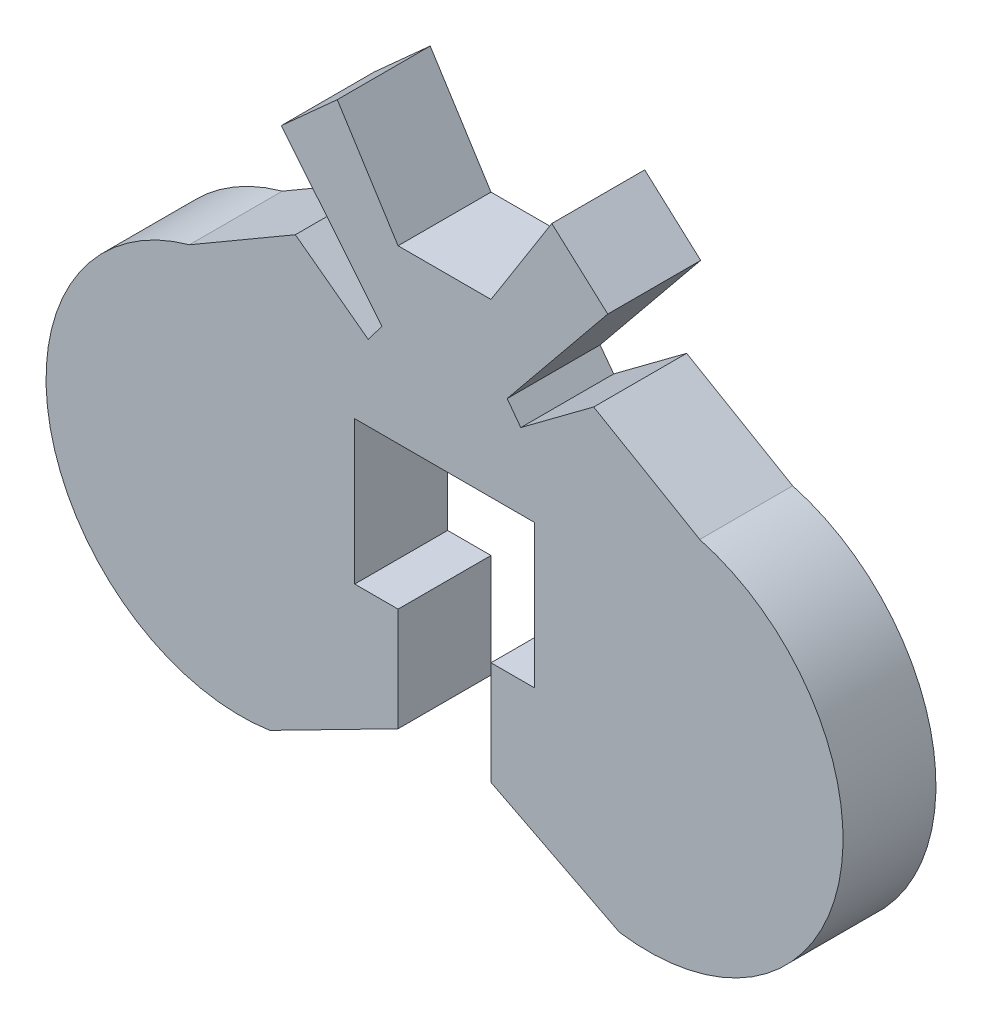
ISO-10303-21;
HEADER;
FILE_DESCRIPTION(('STEP AP214'),'2;1');
FILE_NAME('part.step','',(''),(''),'','','');
FILE_SCHEMA(('AUTOMOTIVE_DESIGN { 1 0 10303 214 1 1 1 1 }'));
ENDSEC;
DATA;
#1=APPLICATION_CONTEXT('core data for automotive mechanical design processes');
#2=APPLICATION_PROTOCOL_DEFINITION('international standard','automotive_design',2000,#1);
#3=PRODUCT_CONTEXT('',#1,'mechanical');
#4=PRODUCT('Part','Part','',(#3));
#5=PRODUCT_RELATED_PRODUCT_CATEGORY('part','',(#4));
#6=PRODUCT_DEFINITION_FORMATION('','',#4);
#7=PRODUCT_DEFINITION_CONTEXT('part definition',#1,'design');
#8=PRODUCT_DEFINITION('design','',#6,#7);
#9=PRODUCT_DEFINITION_SHAPE('','',#8);
#10=(LENGTH_UNIT() NAMED_UNIT(*) SI_UNIT(.MILLI.,.METRE.));
#11=(NAMED_UNIT(*) PLANE_ANGLE_UNIT() SI_UNIT($,.RADIAN.));
#12=(NAMED_UNIT(*) SI_UNIT($,.STERADIAN.) SOLID_ANGLE_UNIT());
#13=UNCERTAINTY_MEASURE_WITH_UNIT(LENGTH_MEASURE(1.E-05),#10,'distance_accuracy_value','');
#14=(GEOMETRIC_REPRESENTATION_CONTEXT(3) GLOBAL_UNCERTAINTY_ASSIGNED_CONTEXT((#13)) GLOBAL_UNIT_ASSIGNED_CONTEXT((#10,
#11,#12)) REPRESENTATION_CONTEXT('',''));
#15=CARTESIAN_POINT('',(0.,0.,0.));
#16=DIRECTION('',(0.,0.,1.));
#17=DIRECTION('',(1.,0.,0.));
#18=AXIS2_PLACEMENT_3D('',#15,#16,#17);
#19=CARTESIAN_POINT('',(-72.3161826663277,193.108811616121,3.));
#20=DIRECTION('',(0.503101526524488,-0.864227316166719,0.));
#21=DIRECTION('',(0.864227316166719,0.503101526524488,0.));
#22=AXIS2_PLACEMENT_3D('',#19,#20,#21);
#23=PLANE('',#22);
#24=DIRECTION('',(-0.864227316166719,-0.503101526524488,0.));
#25=VECTOR('',#24,1.);
#26=CARTESIAN_POINT('',(-72.3161826663277,193.108811616121,0.));
#27=LINE('',#26,#25);
#28=CARTESIAN_POINT('',(-70.6043010627683,194.10536684166,0.));
#29=VERTEX_POINT('',#28);
#30=CARTESIAN_POINT('',(-74.028064269887,192.112256390581,0.));
#31=VERTEX_POINT('',#30);
#32=EDGE_CURVE('E255',#29,#31,#27,.T.);
#33=ORIENTED_EDGE('',*,*,#32,.T.);
#34=DIRECTION('',(0.,0.,-1.));
#35=VECTOR('',#34,1.);
#36=CARTESIAN_POINT('',(-74.028064269887,192.112256390581,3.));
#37=LINE('',#36,#35);
#38=CARTESIAN_POINT('',(-74.028064269887,192.112256390581,3.));
#39=VERTEX_POINT('',#38);
#40=EDGE_CURVE('E371',#39,#31,#37,.T.);
#41=ORIENTED_EDGE('',*,*,#40,.F.);
#42=DIRECTION('',(-0.864227316166719,-0.503101526524488,0.));
#43=VECTOR('',#42,1.);
#44=CARTESIAN_POINT('',(-72.3161826663277,193.108811616121,3.));
#45=LINE('',#44,#43);
#46=CARTESIAN_POINT('',(-70.6043010627683,194.10536684166,3.));
#47=VERTEX_POINT('',#46);
#48=EDGE_CURVE('E323',#47,#39,#45,.T.);
#49=ORIENTED_EDGE('',*,*,#48,.F.);
#50=DIRECTION('',(0.,0.,-1.));
#51=VECTOR('',#50,1.);
#52=CARTESIAN_POINT('',(-70.6043010627683,194.10536684166,3.));
#53=LINE('',#52,#51);
#54=EDGE_CURVE('E251',#47,#29,#53,.T.);
#55=ORIENTED_EDGE('',*,*,#54,.T.);
#56=EDGE_LOOP('',(#33,#41,#49,#55));
#57=FACE_BOUND('',#56,.T.);
#58=ADVANCED_FACE('F38',(#57),#23,.F.);
#59=CARTESIAN_POINT('',(-72.3681894073831,186.048695256863,3.));
#60=DIRECTION('',(0.,0.,-1.));
#61=DIRECTION('',(-1.,0.,0.));
#62=AXIS2_PLACEMENT_3D('',#59,#60,#61);
#63=CYLINDRICAL_SURFACE('',#62,6.28664920140311);
#64=CARTESIAN_POINT('',(-72.3681894073831,186.048695256863,0.));
#65=DIRECTION('',(0.,0.,1.));
#66=DIRECTION('',(1.,0.,0.));
#67=AXIS2_PLACEMENT_3D('',#64,#65,#66);
#68=CIRCLE('',#67,6.28664920140311);
#69=CARTESIAN_POINT('',(-71.4312982419053,179.832249879837,0.));
#70=VERTEX_POINT('',#69);
#71=EDGE_CURVE('E259',#31,#70,#68,.T.);
#72=ORIENTED_EDGE('',*,*,#71,.T.);
#73=DIRECTION('',(0.,0.,-1.));
#74=VECTOR('',#73,1.);
#75=CARTESIAN_POINT('',(-71.4312982419053,179.832249879837,3.));
#76=LINE('',#75,#74);
#77=CARTESIAN_POINT('',(-71.4312982419053,179.832249879837,3.));
#78=VERTEX_POINT('',#77);
#79=EDGE_CURVE('E368',#78,#70,#76,.T.);
#80=ORIENTED_EDGE('',*,*,#79,.F.);
#81=CARTESIAN_POINT('',(-72.3681894073831,186.048695256863,3.));
#82=DIRECTION('',(0.,0.,1.));
#83=DIRECTION('',(1.,0.,0.));
#84=AXIS2_PLACEMENT_3D('',#81,#82,#83);
#85=CIRCLE('',#84,6.28664920140311);
#86=EDGE_CURVE('E159',#39,#78,#85,.T.);
#87=ORIENTED_EDGE('',*,*,#86,.F.);
#88=ORIENTED_EDGE('',*,*,#40,.T.);
#89=EDGE_LOOP('',(#72,#80,#87,#88));
#90=FACE_BOUND('',#89,.T.);
#91=ADVANCED_FACE('F580',(#90),#63,.T.);
#92=CARTESIAN_POINT('',(-69.3597896840998,180.890567600727,3.));
#93=DIRECTION('',(0.45495654078727,-0.890513641666921,0.));
#94=DIRECTION('',(0.890513641666921,0.45495654078727,0.));
#95=AXIS2_PLACEMENT_3D('',#92,#93,#94);
#96=PLANE('',#95);
#97=DIRECTION('',(-0.890513641666921,-0.45495654078727,0.));
#98=VECTOR('',#97,1.);
#99=CARTESIAN_POINT('',(-69.3597896840998,180.890567600727,0.));
#100=LINE('',#99,#98);
#101=CARTESIAN_POINT('',(-67.2882811262942,181.948885321617,0.));
#102=VERTEX_POINT('',#101);
#103=EDGE_CURVE('E264',#102,#70,#100,.T.);
#104=ORIENTED_EDGE('',*,*,#103,.F.);
#105=DIRECTION('',(0.,0.,-1.));
#106=VECTOR('',#105,1.);
#107=CARTESIAN_POINT('',(-67.2882811262942,181.948885321617,3.));
#108=LINE('',#107,#106);
#109=CARTESIAN_POINT('',(-67.2882811262942,181.948885321617,3.));
#110=VERTEX_POINT('',#109);
#111=EDGE_CURVE('E365',#110,#102,#108,.T.);
#112=ORIENTED_EDGE('',*,*,#111,.F.);
#113=DIRECTION('',(-0.890513641666921,-0.45495654078727,0.));
#114=VECTOR('',#113,1.);
#115=CARTESIAN_POINT('',(-69.3597896840998,180.890567600727,3.));
#116=LINE('',#115,#114);
#117=EDGE_CURVE('E430',#110,#78,#116,.T.);
#118=ORIENTED_EDGE('',*,*,#117,.T.);
#119=ORIENTED_EDGE('',*,*,#79,.T.);
#120=EDGE_LOOP('',(#104,#112,#118,#119));
#121=FACE_BOUND('',#120,.T.);
#122=ADVANCED_FACE('F602',(#121),#96,.T.);
#123=CARTESIAN_POINT('',(-67.2882811262942,183.250493427698,3.));
#124=DIRECTION('',(-1.,0.,0.));
#125=DIRECTION('',(0.,0.,1.));
#126=AXIS2_PLACEMENT_3D('',#123,#124,#125);
#127=PLANE('',#126);
#128=DIRECTION('',(0.,1.,0.));
#129=VECTOR('',#128,1.);
#130=CARTESIAN_POINT('',(-67.2882811262942,183.250493427698,0.));
#131=LINE('',#130,#129);
#132=CARTESIAN_POINT('',(-67.2882811262942,185.295085507677,0.));
#133=VERTEX_POINT('',#132);
#134=EDGE_CURVE('E268',#102,#133,#131,.T.);
#135=ORIENTED_EDGE('',*,*,#134,.T.);
#136=DIRECTION('',(0.,0.,1.));
#137=VECTOR('',#136,1.);
#138=CARTESIAN_POINT('',(-67.2882811262942,185.295085507677,3.));
#139=LINE('',#138,#137);
#140=CARTESIAN_POINT('',(-67.2882811262942,185.295085507677,3.));
#141=VERTEX_POINT('',#140);
#142=EDGE_CURVE('E260',#133,#141,#139,.T.);
#143=ORIENTED_EDGE('',*,*,#142,.T.);
#144=DIRECTION('',(0.,1.,0.));
#145=VECTOR('',#144,1.);
#146=CARTESIAN_POINT('',(-67.2882811262942,183.250493427698,3.));
#147=LINE('',#146,#145);
#148=EDGE_CURVE('E434',#110,#141,#147,.T.);
#149=ORIENTED_EDGE('',*,*,#148,.F.);
#150=ORIENTED_EDGE('',*,*,#111,.T.);
#151=EDGE_LOOP('',(#135,#143,#149,#150));
#152=FACE_BOUND('',#151,.T.);
#153=ADVANCED_FACE('F507',(#152),#127,.F.);
#154=CARTESIAN_POINT('',(-64.2882811262942,186.557534406933,3.));
#155=DIRECTION('',(1.,0.,0.));
#156=DIRECTION('',(0.,0.,-1.));
#157=AXIS2_PLACEMENT_3D('',#154,#155,#156);
#158=PLANE('',#157);
#159=DIRECTION('',(0.,-1.,0.));
#160=VECTOR('',#159,1.);
#161=CARTESIAN_POINT('',(-64.2882811262942,186.557534406933,3.));
#162=LINE('',#161,#160);
#163=CARTESIAN_POINT('',(-64.2882811262942,185.295085507677,3.));
#164=VERTEX_POINT('',#163);
#165=CARTESIAN_POINT('',(-64.2882811262942,181.948885321617,3.));
#166=VERTEX_POINT('',#165);
#167=EDGE_CURVE('E438',#164,#166,#162,.T.);
#168=ORIENTED_EDGE('',*,*,#167,.F.);
#169=DIRECTION('',(0.,0.,-1.));
#170=VECTOR('',#169,1.);
#171=CARTESIAN_POINT('',(-64.2882811262942,185.295085507677,3.));
#172=LINE('',#171,#170);
#173=CARTESIAN_POINT('',(-64.2882811262942,185.295085507677,0.));
#174=VERTEX_POINT('',#173);
#175=EDGE_CURVE('E412',#164,#174,#172,.T.);
#176=ORIENTED_EDGE('',*,*,#175,.T.);
#177=DIRECTION('',(0.,-1.,0.));
#178=VECTOR('',#177,1.);
#179=CARTESIAN_POINT('',(-64.2882811262942,186.557534406933,0.));
#180=LINE('',#179,#178);
#181=CARTESIAN_POINT('',(-64.2882811262942,181.948885321617,0.));
#182=VERTEX_POINT('',#181);
#183=EDGE_CURVE('E271',#174,#182,#180,.T.);
#184=ORIENTED_EDGE('',*,*,#183,.T.);
#185=DIRECTION('',(0.,0.,-1.));
#186=VECTOR('',#185,1.);
#187=CARTESIAN_POINT('',(-64.2882811262942,181.948885321617,3.));
#188=LINE('',#187,#186);
#189=EDGE_CURVE('E361',#166,#182,#188,.T.);
#190=ORIENTED_EDGE('',*,*,#189,.F.);
#191=EDGE_LOOP('',(#168,#176,#184,#190));
#192=FACE_BOUND('',#191,.T.);
#193=ADVANCED_FACE('F501',(#192),#158,.F.);
#194=CARTESIAN_POINT('',(-62.2167725684887,180.890567600727,3.));
#195=DIRECTION('',(0.45495654078727,0.890513641666921,0.));
#196=DIRECTION('',(-0.890513641666921,0.45495654078727,0.));
#197=AXIS2_PLACEMENT_3D('',#194,#195,#196);
#198=PLANE('',#197);
#199=DIRECTION('',(0.890513641666921,-0.45495654078727,0.));
#200=VECTOR('',#199,1.);
#201=CARTESIAN_POINT('',(-62.2167725684887,180.890567600727,0.));
#202=LINE('',#201,#200);
#203=CARTESIAN_POINT('',(-60.1452640106832,179.832249879837,0.));
#204=VERTEX_POINT('',#203);
#205=EDGE_CURVE('E274',#182,#204,#202,.T.);
#206=ORIENTED_EDGE('',*,*,#205,.T.);
#207=DIRECTION('',(0.,0.,-1.));
#208=VECTOR('',#207,1.);
#209=CARTESIAN_POINT('',(-60.1452640106832,179.832249879837,3.));
#210=LINE('',#209,#208);
#211=CARTESIAN_POINT('',(-60.1452640106832,179.832249879837,3.));
#212=VERTEX_POINT('',#211);
#213=EDGE_CURVE('E358',#212,#204,#210,.T.);
#214=ORIENTED_EDGE('',*,*,#213,.F.);
#215=DIRECTION('',(0.890513641666921,-0.45495654078727,0.));
#216=VECTOR('',#215,1.);
#217=CARTESIAN_POINT('',(-62.2167725684887,180.890567600727,3.));
#218=LINE('',#217,#216);
#219=EDGE_CURVE('E441',#166,#212,#218,.T.);
#220=ORIENTED_EDGE('',*,*,#219,.F.);
#221=ORIENTED_EDGE('',*,*,#189,.T.);
#222=EDGE_LOOP('',(#206,#214,#220,#221));
#223=FACE_BOUND('',#222,.T.);
#224=ADVANCED_FACE('F506',(#223),#198,.F.);
#225=CARTESIAN_POINT('',(-59.2083728452044,186.048695256863,3.));
#226=DIRECTION('',(0.,0.,-1.));
#227=DIRECTION('',(-1.,0.,0.));
#228=AXIS2_PLACEMENT_3D('',#225,#226,#227);
#229=CYLINDRICAL_SURFACE('',#228,6.2866492014031);
#230=CARTESIAN_POINT('',(-59.2083728452044,186.048695256863,0.));
#231=DIRECTION('',(0.,0.,-1.));
#232=DIRECTION('',(1.,0.,0.));
#233=AXIS2_PLACEMENT_3D('',#230,#231,#232);
#234=CIRCLE('',#233,6.2866492014031);
#235=CARTESIAN_POINT('',(-57.5484979827017,192.112256390581,0.));
#236=VERTEX_POINT('',#235);
#237=EDGE_CURVE('E278',#236,#204,#234,.T.);
#238=ORIENTED_EDGE('',*,*,#237,.F.);
#239=DIRECTION('',(0.,0.,-1.));
#240=VECTOR('',#239,1.);
#241=CARTESIAN_POINT('',(-57.5484979827017,192.112256390581,3.));
#242=LINE('',#241,#240);
#243=CARTESIAN_POINT('',(-57.5484979827017,192.112256390581,3.));
#244=VERTEX_POINT('',#243);
#245=EDGE_CURVE('E355',#244,#236,#242,.T.);
#246=ORIENTED_EDGE('',*,*,#245,.F.);
#247=CARTESIAN_POINT('',(-59.2083728452044,186.048695256863,3.));
#248=DIRECTION('',(0.,0.,-1.));
#249=DIRECTION('',(1.,0.,0.));
#250=AXIS2_PLACEMENT_3D('',#247,#248,#249);
#251=CIRCLE('',#250,6.2866492014031);
#252=EDGE_CURVE('E444',#244,#212,#251,.T.);
#253=ORIENTED_EDGE('',*,*,#252,.T.);
#254=ORIENTED_EDGE('',*,*,#213,.T.);
#255=EDGE_LOOP('',(#238,#246,#253,#254));
#256=FACE_BOUND('',#255,.T.);
#257=ADVANCED_FACE('F530',(#256),#229,.T.);
#258=CARTESIAN_POINT('',(-59.2603795862609,193.108811616121,3.));
#259=DIRECTION('',(0.503101526524491,0.864227316166717,0.));
#260=DIRECTION('',(-0.864227316166717,0.503101526524491,0.));
#261=AXIS2_PLACEMENT_3D('',#258,#259,#260);
#262=PLANE('',#261);
#263=DIRECTION('',(0.864227316166717,-0.503101526524491,0.));
#264=VECTOR('',#263,1.);
#265=CARTESIAN_POINT('',(-59.2603795862609,193.108811616121,0.));
#266=LINE('',#265,#264);
#267=CARTESIAN_POINT('',(-60.9722611898201,194.10536684166,0.));
#268=VERTEX_POINT('',#267);
#269=EDGE_CURVE('E282',#268,#236,#266,.T.);
#270=ORIENTED_EDGE('',*,*,#269,.F.);
#271=DIRECTION('',(0.,0.,-1.));
#272=VECTOR('',#271,1.);
#273=CARTESIAN_POINT('',(-60.9722611898201,194.10536684166,3.));
#274=LINE('',#273,#272);
#275=CARTESIAN_POINT('',(-60.9722611898201,194.10536684166,3.));
#276=VERTEX_POINT('',#275);
#277=EDGE_CURVE('E352',#276,#268,#274,.T.);
#278=ORIENTED_EDGE('',*,*,#277,.F.);
#279=DIRECTION('',(0.864227316166717,-0.503101526524491,0.));
#280=VECTOR('',#279,1.);
#281=CARTESIAN_POINT('',(-59.2603795862609,193.108811616121,3.));
#282=LINE('',#281,#280);
#283=EDGE_CURVE('E448',#276,#244,#282,.T.);
#284=ORIENTED_EDGE('',*,*,#283,.T.);
#285=ORIENTED_EDGE('',*,*,#245,.T.);
#286=EDGE_LOOP('',(#270,#278,#284,#285));
#287=FACE_BOUND('',#286,.T.);
#288=ADVANCED_FACE('F520',(#287),#262,.T.);
#289=CARTESIAN_POINT('',(-62.1493132803896,193.22889515274,3.));
#290=DIRECTION('',(-0.597241395654516,0.802061540853722,0.));
#291=DIRECTION('',(-0.802061540853722,-0.597241395654516,0.));
#292=AXIS2_PLACEMENT_3D('',#289,#290,#291);
#293=PLANE('',#292);
#294=DIRECTION('',(0.802061540853722,0.597241395654516,0.));
#295=VECTOR('',#294,1.);
#296=CARTESIAN_POINT('',(-62.1493132803896,193.22889515274,0.));
#297=LINE('',#296,#295);
#298=CARTESIAN_POINT('',(-63.3263653709592,192.35242346382,0.));
#299=VERTEX_POINT('',#298);
#300=EDGE_CURVE('E286',#299,#268,#297,.T.);
#301=ORIENTED_EDGE('',*,*,#300,.F.);
#302=DIRECTION('',(0.,0.,-1.));
#303=VECTOR('',#302,1.);
#304=CARTESIAN_POINT('',(-63.3263653709592,192.35242346382,3.));
#305=LINE('',#304,#303);
#306=CARTESIAN_POINT('',(-63.3263653709592,192.35242346382,3.));
#307=VERTEX_POINT('',#306);
#308=EDGE_CURVE('E349',#307,#299,#305,.T.);
#309=ORIENTED_EDGE('',*,*,#308,.F.);
#310=DIRECTION('',(0.802061540853722,0.597241395654516,0.));
#311=VECTOR('',#310,1.);
#312=CARTESIAN_POINT('',(-62.1493132803896,193.22889515274,3.));
#313=LINE('',#312,#311);
#314=EDGE_CURVE('E452',#307,#276,#313,.T.);
#315=ORIENTED_EDGE('',*,*,#314,.T.);
#316=ORIENTED_EDGE('',*,*,#277,.T.);
#317=EDGE_LOOP('',(#301,#309,#315,#316));
#318=FACE_BOUND('',#317,.T.);
#319=ADVANCED_FACE('F514',(#318),#293,.T.);
#320=CARTESIAN_POINT('',(-63.5463576841203,192.647860744212,3.));
#321=DIRECTION('',(-0.802061540853723,-0.597241395654515,0.));
#322=DIRECTION('',(0.597241395654515,-0.802061540853723,0.));
#323=AXIS2_PLACEMENT_3D('',#320,#321,#322);
#324=PLANE('',#323);
#325=DIRECTION('',(-0.597241395654515,0.802061540853723,0.));
#326=VECTOR('',#325,1.);
#327=CARTESIAN_POINT('',(-63.5463576841203,192.647860744212,0.));
#328=LINE('',#327,#326);
#329=CARTESIAN_POINT('',(-63.7663499972815,192.943298024605,0.));
#330=VERTEX_POINT('',#329);
#331=EDGE_CURVE('E290',#299,#330,#328,.T.);
#332=ORIENTED_EDGE('',*,*,#331,.T.);
#333=DIRECTION('',(0.,0.,-1.));
#334=VECTOR('',#333,1.);
#335=CARTESIAN_POINT('',(-63.7663499972815,192.943298024605,3.));
#336=LINE('',#335,#334);
#337=CARTESIAN_POINT('',(-63.7663499972815,192.943298024605,3.));
#338=VERTEX_POINT('',#337);
#339=EDGE_CURVE('E345',#338,#330,#336,.T.);
#340=ORIENTED_EDGE('',*,*,#339,.F.);
#341=DIRECTION('',(-0.597241395654515,0.802061540853723,0.));
#342=VECTOR('',#341,1.);
#343=CARTESIAN_POINT('',(-63.5463576841203,192.647860744212,3.));
#344=LINE('',#343,#342);
#345=EDGE_CURVE('E456',#307,#338,#344,.T.);
#346=ORIENTED_EDGE('',*,*,#345,.F.);
#347=ORIENTED_EDGE('',*,*,#308,.T.);
#348=EDGE_LOOP('',(#332,#340,#346,#347));
#349=FACE_BOUND('',#348,.T.);
#350=ADVANCED_FACE('F519',(#349),#324,.F.);
#351=CARTESIAN_POINT('',(-62.1423883232009,194.936670732909,3.));
#352=DIRECTION('',(-0.775286014305936,0.631610319755477,0.));
#353=DIRECTION('',(-0.631610319755478,-0.775286014305936,0.));
#354=AXIS2_PLACEMENT_3D('',#351,#352,#353);
#355=PLANE('',#354);
#356=DIRECTION('',(0.631610319755478,0.775286014305936,0.));
#357=VECTOR('',#356,1.);
#358=CARTESIAN_POINT('',(-62.1423883232009,194.936670732909,0.));
#359=LINE('',#358,#357);
#360=CARTESIAN_POINT('',(-60.5184266491204,196.930043441212,0.));
#361=VERTEX_POINT('',#360);
#362=EDGE_CURVE('E293',#330,#361,#359,.T.);
#363=ORIENTED_EDGE('',*,*,#362,.T.);
#364=DIRECTION('',(0.,0.,-1.));
#365=VECTOR('',#364,1.);
#366=CARTESIAN_POINT('',(-60.5184266491204,196.930043441212,3.));
#367=LINE('',#366,#365);
#368=CARTESIAN_POINT('',(-60.5184266491204,196.930043441212,3.));
#369=VERTEX_POINT('',#368);
#370=EDGE_CURVE('E342',#369,#361,#367,.T.);
#371=ORIENTED_EDGE('',*,*,#370,.F.);
#372=DIRECTION('',(0.631610319755478,0.775286014305936,0.));
#373=VECTOR('',#372,1.);
#374=CARTESIAN_POINT('',(-62.1423883232009,194.936670732909,3.));
#375=LINE('',#374,#373);
#376=EDGE_CURVE('E459',#338,#369,#375,.T.);
#377=ORIENTED_EDGE('',*,*,#376,.F.);
#378=ORIENTED_EDGE('',*,*,#339,.T.);
#379=EDGE_LOOP('',(#363,#371,#377,#378));
#380=FACE_BOUND('',#379,.T.);
#381=ADVANCED_FACE('F539',(#380),#355,.F.);
#382=CARTESIAN_POINT('',(-61.4218751648041,197.74438241128,3.));
#383=DIRECTION('',(0.669525663872529,0.74278892386468,0.));
#384=DIRECTION('',(-0.74278892386468,0.669525663872529,0.));
#385=AXIS2_PLACEMENT_3D('',#382,#383,#384);
#386=PLANE('',#385);
#387=DIRECTION('',(0.74278892386468,-0.669525663872529,0.));
#388=VECTOR('',#387,1.);
#389=CARTESIAN_POINT('',(-61.4218751648041,197.74438241128,0.));
#390=LINE('',#389,#388);
#391=CARTESIAN_POINT('',(-62.3253236804879,198.558721381348,0.));
#392=VERTEX_POINT('',#391);
#393=EDGE_CURVE('E297',#392,#361,#390,.T.);
#394=ORIENTED_EDGE('',*,*,#393,.F.);
#395=DIRECTION('',(0.,0.,-1.));
#396=VECTOR('',#395,1.);
#397=CARTESIAN_POINT('',(-62.3253236804879,198.558721381348,3.));
#398=LINE('',#397,#396);
#399=CARTESIAN_POINT('',(-62.3253236804879,198.558721381348,3.));
#400=VERTEX_POINT('',#399);
#401=EDGE_CURVE('E339',#400,#392,#398,.T.);
#402=ORIENTED_EDGE('',*,*,#401,.F.);
#403=DIRECTION('',(0.74278892386468,-0.669525663872529,0.));
#404=VECTOR('',#403,1.);
#405=CARTESIAN_POINT('',(-61.4218751648041,197.74438241128,3.));
#406=LINE('',#405,#404);
#407=EDGE_CURVE('E462',#400,#369,#406,.T.);
#408=ORIENTED_EDGE('',*,*,#407,.T.);
#409=ORIENTED_EDGE('',*,*,#370,.T.);
#410=EDGE_LOOP('',(#394,#402,#408,#409));
#411=FACE_BOUND('',#410,.T.);
#412=ADVANCED_FACE('F551',(#411),#386,.T.);
#413=CARTESIAN_POINT('',(-62.8258445257236,197.767069618765,3.));
#414=DIRECTION('',(-0.845233198816856,0.534397641852792,0.));
#415=DIRECTION('',(-0.534397641852792,-0.845233198816857,0.));
#416=AXIS2_PLACEMENT_3D('',#413,#414,#415);
#417=PLANE('',#416);
#418=DIRECTION('',(0.534397641852792,0.845233198816856,0.));
#419=VECTOR('',#418,1.);
#420=CARTESIAN_POINT('',(-62.8258445257236,197.767069618765,0.));
#421=LINE('',#420,#419);
#422=CARTESIAN_POINT('',(-64.2882811262942,195.453998098311,0.));
#423=VERTEX_POINT('',#422);
#424=EDGE_CURVE('E301',#423,#392,#421,.T.);
#425=ORIENTED_EDGE('',*,*,#424,.F.);
#426=DIRECTION('',(0.,0.,-1.));
#427=VECTOR('',#426,1.);
#428=CARTESIAN_POINT('',(-64.2882811262942,195.453998098311,3.));
#429=LINE('',#428,#427);
#430=CARTESIAN_POINT('',(-64.2882811262942,195.453998098311,3.));
#431=VERTEX_POINT('',#430);
#432=EDGE_CURVE('E336',#431,#423,#429,.T.);
#433=ORIENTED_EDGE('',*,*,#432,.F.);
#434=DIRECTION('',(0.534397641852792,0.845233198816856,0.));
#435=VECTOR('',#434,1.);
#436=CARTESIAN_POINT('',(-62.8258445257236,197.767069618765,3.));
#437=LINE('',#436,#435);
#438=EDGE_CURVE('E466',#431,#400,#437,.T.);
#439=ORIENTED_EDGE('',*,*,#438,.T.);
#440=ORIENTED_EDGE('',*,*,#401,.T.);
#441=EDGE_LOOP('',(#425,#433,#439,#440));
#442=FACE_BOUND('',#441,.T.);
#443=ADVANCED_FACE('F545',(#442),#417,.T.);
#444=CARTESIAN_POINT('',(-65.0382811262942,195.453998098311,3.));
#445=DIRECTION('',(0.,-1.,0.));
#446=DIRECTION('',(0.,0.,-1.));
#447=AXIS2_PLACEMENT_3D('',#444,#445,#446);
#448=PLANE('',#447);
#449=DIRECTION('',(-1.,0.,0.));
#450=VECTOR('',#449,1.);
#451=CARTESIAN_POINT('',(-65.0382811262942,195.453998098311,0.));
#452=LINE('',#451,#450);
#453=CARTESIAN_POINT('',(-67.2882811262942,195.453998098311,0.));
#454=VERTEX_POINT('',#453);
#455=EDGE_CURVE('E305',#423,#454,#452,.T.);
#456=ORIENTED_EDGE('',*,*,#455,.T.);
#457=DIRECTION('',(0.,0.,-1.));
#458=VECTOR('',#457,1.);
#459=CARTESIAN_POINT('',(-67.2882811262942,195.453998098311,3.));
#460=LINE('',#459,#458);
#461=CARTESIAN_POINT('',(-67.2882811262942,195.453998098311,3.));
#462=VERTEX_POINT('',#461);
#463=EDGE_CURVE('E333',#462,#454,#460,.T.);
#464=ORIENTED_EDGE('',*,*,#463,.F.);
#465=DIRECTION('',(-1.,0.,0.));
#466=VECTOR('',#465,1.);
#467=CARTESIAN_POINT('',(-65.0382811262942,195.453998098311,3.));
#468=LINE('',#467,#466);
#469=EDGE_CURVE('E470',#431,#462,#468,.T.);
#470=ORIENTED_EDGE('',*,*,#469,.F.);
#471=ORIENTED_EDGE('',*,*,#432,.T.);
#472=EDGE_LOOP('',(#456,#464,#470,#471));
#473=FACE_BOUND('',#472,.T.);
#474=ADVANCED_FACE('F550',(#473),#448,.F.);
#475=CARTESIAN_POINT('',(-67.7692390039617,196.214707977246,3.));
#476=DIRECTION('',(0.845233198816857,0.53439764185279,0.));
#477=DIRECTION('',(-0.53439764185279,0.845233198816857,0.));
#478=AXIS2_PLACEMENT_3D('',#475,#476,#477);
#479=PLANE('',#478);
#480=DIRECTION('',(0.53439764185279,-0.845233198816857,0.));
#481=VECTOR('',#480,1.);
#482=CARTESIAN_POINT('',(-67.7692390039617,196.214707977246,0.));
#483=LINE('',#482,#481);
#484=CARTESIAN_POINT('',(-69.2512385721006,198.558721381348,0.));
#485=VERTEX_POINT('',#484);
#486=EDGE_CURVE('E309',#485,#454,#483,.T.);
#487=ORIENTED_EDGE('',*,*,#486,.F.);
#488=DIRECTION('',(0.,0.,-1.));
#489=VECTOR('',#488,1.);
#490=CARTESIAN_POINT('',(-69.2512385721006,198.558721381348,3.));
#491=LINE('',#490,#489);
#492=CARTESIAN_POINT('',(-69.2512385721006,198.558721381348,3.));
#493=VERTEX_POINT('',#492);
#494=EDGE_CURVE('E330',#493,#485,#491,.T.);
#495=ORIENTED_EDGE('',*,*,#494,.F.);
#496=DIRECTION('',(0.53439764185279,-0.845233198816857,0.));
#497=VECTOR('',#496,1.);
#498=CARTESIAN_POINT('',(-67.7692390039617,196.214707977246,3.));
#499=LINE('',#498,#497);
#500=EDGE_CURVE('E473',#493,#462,#499,.T.);
#501=ORIENTED_EDGE('',*,*,#500,.T.);
#502=ORIENTED_EDGE('',*,*,#463,.T.);
#503=EDGE_LOOP('',(#487,#495,#501,#502));
#504=FACE_BOUND('',#503,.T.);
#505=ADVANCED_FACE('F561',(#504),#479,.T.);
#506=CARTESIAN_POINT('',(-70.1546870877843,197.74438241128,3.));
#507=DIRECTION('',(0.669525663872529,-0.74278892386468,0.));
#508=DIRECTION('',(0.74278892386468,0.669525663872529,0.));
#509=AXIS2_PLACEMENT_3D('',#506,#507,#508);
#510=PLANE('',#509);
#511=DIRECTION('',(-0.74278892386468,-0.669525663872529,0.));
#512=VECTOR('',#511,1.);
#513=CARTESIAN_POINT('',(-70.1546870877843,197.74438241128,0.));
#514=LINE('',#513,#512);
#515=CARTESIAN_POINT('',(-71.0581356034681,196.930043441212,0.));
#516=VERTEX_POINT('',#515);
#517=EDGE_CURVE('E313',#485,#516,#514,.T.);
#518=ORIENTED_EDGE('',*,*,#517,.T.);
#519=DIRECTION('',(0.,0.,-1.));
#520=VECTOR('',#519,1.);
#521=CARTESIAN_POINT('',(-71.0581356034681,196.930043441212,3.));
#522=LINE('',#521,#520);
#523=CARTESIAN_POINT('',(-71.0581356034681,196.930043441212,3.));
#524=VERTEX_POINT('',#523);
#525=EDGE_CURVE('E232',#524,#516,#522,.T.);
#526=ORIENTED_EDGE('',*,*,#525,.F.);
#527=DIRECTION('',(-0.74278892386468,-0.669525663872529,0.));
#528=VECTOR('',#527,1.);
#529=CARTESIAN_POINT('',(-70.1546870877843,197.74438241128,3.));
#530=LINE('',#529,#528);
#531=EDGE_CURVE('E240',#493,#524,#530,.T.);
#532=ORIENTED_EDGE('',*,*,#531,.F.);
#533=ORIENTED_EDGE('',*,*,#494,.T.);
#534=EDGE_LOOP('',(#518,#526,#532,#533));
#535=FACE_BOUND('',#534,.T.);
#536=ADVANCED_FACE('F570',(#535),#510,.F.);
#537=CARTESIAN_POINT('',(-69.4341739293875,194.936670732909,3.));
#538=DIRECTION('',(-0.775286014305936,-0.631610319755477,0.));
#539=DIRECTION('',(0.631610319755477,-0.775286014305937,0.));
#540=AXIS2_PLACEMENT_3D('',#537,#538,#539);
#541=PLANE('',#540);
#542=DIRECTION('',(-0.631610319755477,0.775286014305936,0.));
#543=VECTOR('',#542,1.);
#544=CARTESIAN_POINT('',(-69.4341739293875,194.936670732909,0.));
#545=LINE('',#544,#543);
#546=CARTESIAN_POINT('',(-67.810212255307,192.943298024605,0.));
#547=VERTEX_POINT('',#546);
#548=EDGE_CURVE('E226',#547,#516,#545,.T.);
#549=ORIENTED_EDGE('',*,*,#548,.F.);
#550=DIRECTION('',(0.,0.,-1.));
#551=VECTOR('',#550,1.);
#552=CARTESIAN_POINT('',(-67.810212255307,192.943298024605,3.));
#553=LINE('',#552,#551);
#554=CARTESIAN_POINT('',(-67.810212255307,192.943298024605,3.));
#555=VERTEX_POINT('',#554);
#556=EDGE_CURVE('E221',#555,#547,#553,.T.);
#557=ORIENTED_EDGE('',*,*,#556,.F.);
#558=DIRECTION('',(-0.631610319755477,0.775286014305936,0.));
#559=VECTOR('',#558,1.);
#560=CARTESIAN_POINT('',(-69.4341739293875,194.936670732909,3.));
#561=LINE('',#560,#559);
#562=EDGE_CURVE('E224',#555,#524,#561,.T.);
#563=ORIENTED_EDGE('',*,*,#562,.T.);
#564=ORIENTED_EDGE('',*,*,#525,.T.);
#565=EDGE_LOOP('',(#549,#557,#563,#564));
#566=FACE_BOUND('',#565,.T.);
#567=ADVANCED_FACE('F223',(#566),#541,.T.);
#568=CARTESIAN_POINT('',(-68.0302045684681,192.647860744212,3.));
#569=DIRECTION('',(-0.802061540853727,0.597241395654508,0.));
#570=DIRECTION('',(-0.597241395654509,-0.802061540853727,0.));
#571=AXIS2_PLACEMENT_3D('',#568,#569,#570);
#572=PLANE('',#571);
#573=DIRECTION('',(0.597241395654509,0.802061540853727,0.));
#574=VECTOR('',#573,1.);
#575=CARTESIAN_POINT('',(-68.0302045684681,192.647860744212,0.));
#576=LINE('',#575,#574);
#577=CARTESIAN_POINT('',(-68.2501968816292,192.35242346382,0.));
#578=VERTEX_POINT('',#577);
#579=EDGE_CURVE('E319',#578,#547,#576,.T.);
#580=ORIENTED_EDGE('',*,*,#579,.F.);
#581=DIRECTION('',(0.,0.,-1.));
#582=VECTOR('',#581,1.);
#583=CARTESIAN_POINT('',(-68.2501968816292,192.35242346382,3.));
#584=LINE('',#583,#582);
#585=CARTESIAN_POINT('',(-68.2501968816292,192.35242346382,3.));
#586=VERTEX_POINT('',#585);
#587=EDGE_CURVE('E233',#586,#578,#584,.T.);
#588=ORIENTED_EDGE('',*,*,#587,.F.);
#589=DIRECTION('',(0.597241395654509,0.802061540853727,0.));
#590=VECTOR('',#589,1.);
#591=CARTESIAN_POINT('',(-68.0302045684681,192.647860744212,3.));
#592=LINE('',#591,#590);
#593=EDGE_CURVE('E237',#586,#555,#592,.T.);
#594=ORIENTED_EDGE('',*,*,#593,.T.);
#595=ORIENTED_EDGE('',*,*,#556,.T.);
#596=EDGE_LOOP('',(#580,#588,#594,#595));
#597=FACE_BOUND('',#596,.T.);
#598=ADVANCED_FACE('F244',(#597),#572,.T.);
#599=CARTESIAN_POINT('',(-69.4272489721988,193.22889515274,3.));
#600=DIRECTION('',(-0.597241395654517,-0.802061540853721,0.));
#601=DIRECTION('',(0.802061540853721,-0.597241395654517,0.));
#602=AXIS2_PLACEMENT_3D('',#599,#600,#601);
#603=PLANE('',#602);
#604=DIRECTION('',(-0.802061540853721,0.597241395654517,0.));
#605=VECTOR('',#604,1.);
#606=CARTESIAN_POINT('',(-69.4272489721988,193.22889515274,0.));
#607=LINE('',#606,#605);
#608=EDGE_CURVE('E148',#578,#29,#607,.T.);
#609=ORIENTED_EDGE('',*,*,#608,.T.);
#610=ORIENTED_EDGE('',*,*,#54,.F.);
#611=DIRECTION('',(-0.802061540853721,0.597241395654517,0.));
#612=VECTOR('',#611,1.);
#613=CARTESIAN_POINT('',(-69.4272489721988,193.22889515274,3.));
#614=LINE('',#613,#612);
#615=EDGE_CURVE('E66',#586,#47,#614,.T.);
#616=ORIENTED_EDGE('',*,*,#615,.F.);
#617=ORIENTED_EDGE('',*,*,#587,.T.);
#618=EDGE_LOOP('',(#609,#610,#616,#617));
#619=FACE_BOUND('',#618,.T.);
#620=ADVANCED_FACE('F496',(#619),#603,.F.);
#621=CARTESIAN_POINT('',(221.883213984944,-32.3050135869362,3.));
#622=DIRECTION('',(0.,0.,1.));
#623=DIRECTION('',(1.,0.,0.));
#624=AXIS2_PLACEMENT_3D('',#621,#622,#623);
#625=PLANE('',#624);
#626=DIRECTION('',(1.,0.,0.));
#627=VECTOR('',#626,1.);
#628=CARTESIAN_POINT('',(-62.888281126294,185.295085507677,3.));
#629=LINE('',#628,#627);
#630=CARTESIAN_POINT('',(-62.888281126294,185.295085507677,3.));
#631=VERTEX_POINT('',#630);
#632=EDGE_CURVE('E410',#164,#631,#629,.T.);
#633=ORIENTED_EDGE('',*,*,#632,.F.);
#634=ORIENTED_EDGE('',*,*,#167,.T.);
#635=ORIENTED_EDGE('',*,*,#219,.T.);
#636=ORIENTED_EDGE('',*,*,#252,.F.);
#637=ORIENTED_EDGE('',*,*,#283,.F.);
#638=ORIENTED_EDGE('',*,*,#314,.F.);
#639=ORIENTED_EDGE('',*,*,#345,.T.);
#640=ORIENTED_EDGE('',*,*,#376,.T.);
#641=ORIENTED_EDGE('',*,*,#407,.F.);
#642=ORIENTED_EDGE('',*,*,#438,.F.);
#643=ORIENTED_EDGE('',*,*,#469,.T.);
#644=ORIENTED_EDGE('',*,*,#500,.F.);
#645=ORIENTED_EDGE('',*,*,#531,.T.);
#646=ORIENTED_EDGE('',*,*,#562,.F.);
#647=ORIENTED_EDGE('',*,*,#593,.F.);
#648=ORIENTED_EDGE('',*,*,#615,.T.);
#649=ORIENTED_EDGE('',*,*,#48,.T.);
#650=ORIENTED_EDGE('',*,*,#86,.T.);
#651=ORIENTED_EDGE('',*,*,#117,.F.);
#652=ORIENTED_EDGE('',*,*,#148,.T.);
#653=CARTESIAN_POINT('',(-68.688281126294,185.295085507677,3.));
#654=VERTEX_POINT('',#653);
#655=EDGE_CURVE('E419',#654,#141,#629,.T.);
#656=ORIENTED_EDGE('',*,*,#655,.F.);
#657=DIRECTION('',(0.,-1.,0.));
#658=VECTOR('',#657,1.);
#659=CARTESIAN_POINT('',(-68.688281126294,185.295085507677,3.));
#660=LINE('',#659,#658);
#661=CARTESIAN_POINT('',(-68.688281126294,189.920165866781,3.));
#662=VERTEX_POINT('',#661);
#663=EDGE_CURVE('E746',#662,#654,#660,.T.);
#664=ORIENTED_EDGE('',*,*,#663,.F.);
#665=DIRECTION('',(-1.,0.,0.));
#666=VECTOR('',#665,1.);
#667=CARTESIAN_POINT('',(-62.888281126294,189.920165866781,3.));
#668=LINE('',#667,#666);
#669=CARTESIAN_POINT('',(-62.888281126294,189.920165866781,3.));
#670=VERTEX_POINT('',#669);
#671=EDGE_CURVE('E739',#670,#662,#668,.T.);
#672=ORIENTED_EDGE('',*,*,#671,.F.);
#673=DIRECTION('',(0.,1.,0.));
#674=VECTOR('',#673,1.);
#675=CARTESIAN_POINT('',(-62.888281126294,185.295085507677,3.));
#676=LINE('',#675,#674);
#677=EDGE_CURVE('E742',#631,#670,#676,.T.);
#678=ORIENTED_EDGE('',*,*,#677,.F.);
#679=EDGE_LOOP('',(#633,#634,#635,#636,#637,#638,#639,#640,#641,#642,#643,#644,#645,#646,#647,
#648,#649,#650,#651,#652,#656,#664,#672,#678));
#680=FACE_BOUND('',#679,.T.);
#681=ADVANCED_FACE('F236',(#680),#625,.T.);
#682=CARTESIAN_POINT('',(221.883213984944,-32.3050135869362,0.));
#683=DIRECTION('',(0.,0.,1.));
#684=DIRECTION('',(1.,0.,0.));
#685=AXIS2_PLACEMENT_3D('',#682,#683,#684);
#686=PLANE('',#685);
#687=ORIENTED_EDGE('',*,*,#183,.F.);
#688=DIRECTION('',(1.,0.,0.));
#689=VECTOR('',#688,1.);
#690=CARTESIAN_POINT('',(221.883213984944,185.295085507677,0.));
#691=LINE('',#690,#689);
#692=CARTESIAN_POINT('',(-62.888281126294,185.295085507677,0.));
#693=VERTEX_POINT('',#692);
#694=EDGE_CURVE('E11',#174,#693,#691,.T.);
#695=ORIENTED_EDGE('',*,*,#694,.T.);
#696=DIRECTION('',(0.,1.,0.));
#697=VECTOR('',#696,1.);
#698=CARTESIAN_POINT('',(-62.888281126294,-32.3050135869362,0.));
#699=LINE('',#698,#697);
#700=CARTESIAN_POINT('',(-62.888281126294,189.920165866781,0.));
#701=VERTEX_POINT('',#700);
#702=EDGE_CURVE('E41',#693,#701,#699,.T.);
#703=ORIENTED_EDGE('',*,*,#702,.T.);
#704=DIRECTION('',(-1.,0.,0.));
#705=VECTOR('',#704,1.);
#706=CARTESIAN_POINT('',(221.883213984944,189.920165866781,0.));
#707=LINE('',#706,#705);
#708=CARTESIAN_POINT('',(-68.6882811262941,189.920165866781,0.));
#709=VERTEX_POINT('',#708);
#710=EDGE_CURVE('E374',#701,#709,#707,.T.);
#711=ORIENTED_EDGE('',*,*,#710,.T.);
#712=DIRECTION('',(0.,-1.,0.));
#713=VECTOR('',#712,1.);
#714=CARTESIAN_POINT('',(-68.688281126294,-32.3050135869362,0.));
#715=LINE('',#714,#713);
#716=CARTESIAN_POINT('',(-68.688281126294,185.295085507677,0.));
#717=VERTEX_POINT('',#716);
#718=EDGE_CURVE('E377',#709,#717,#715,.T.);
#719=ORIENTED_EDGE('',*,*,#718,.T.);
#720=EDGE_CURVE('E46',#717,#133,#691,.T.);
#721=ORIENTED_EDGE('',*,*,#720,.T.);
#722=ORIENTED_EDGE('',*,*,#134,.F.);
#723=ORIENTED_EDGE('',*,*,#103,.T.);
#724=ORIENTED_EDGE('',*,*,#71,.F.);
#725=ORIENTED_EDGE('',*,*,#32,.F.);
#726=ORIENTED_EDGE('',*,*,#608,.F.);
#727=ORIENTED_EDGE('',*,*,#579,.T.);
#728=ORIENTED_EDGE('',*,*,#548,.T.);
#729=ORIENTED_EDGE('',*,*,#517,.F.);
#730=ORIENTED_EDGE('',*,*,#486,.T.);
#731=ORIENTED_EDGE('',*,*,#455,.F.);
#732=ORIENTED_EDGE('',*,*,#424,.T.);
#733=ORIENTED_EDGE('',*,*,#393,.T.);
#734=ORIENTED_EDGE('',*,*,#362,.F.);
#735=ORIENTED_EDGE('',*,*,#331,.F.);
#736=ORIENTED_EDGE('',*,*,#300,.T.);
#737=ORIENTED_EDGE('',*,*,#269,.T.);
#738=ORIENTED_EDGE('',*,*,#237,.T.);
#739=ORIENTED_EDGE('',*,*,#205,.F.);
#740=EDGE_LOOP('',(#687,#695,#703,#711,#719,#721,#722,#723,#724,#725,#726,#727,#728,#729,#730,
#731,#732,#733,#734,#735,#736,#737,#738,#739));
#741=FACE_BOUND('',#740,.T.);
#742=ADVANCED_FACE('F387',(#741),#686,.F.);
#743=CARTESIAN_POINT('',(-62.888281126294,185.295085507677,-7.));
#744=DIRECTION('',(1.,0.,0.));
#745=DIRECTION('',(0.,0.,-1.));
#746=AXIS2_PLACEMENT_3D('',#743,#744,#745);
#747=PLANE('',#746);
#748=DIRECTION('',(0.,0.,1.));
#749=VECTOR('',#748,1.);
#750=CARTESIAN_POINT('',(-62.888281126294,185.295085507677,-7.));
#751=LINE('',#750,#749);
#752=EDGE_CURVE('E399',#693,#631,#751,.T.);
#753=ORIENTED_EDGE('',*,*,#752,.T.);
#754=ORIENTED_EDGE('',*,*,#677,.T.);
#755=DIRECTION('',(0.,0.,1.));
#756=VECTOR('',#755,1.);
#757=CARTESIAN_POINT('',(-62.888281126294,189.920165866781,-7.));
#758=LINE('',#757,#756);
#759=EDGE_CURVE('E402',#701,#670,#758,.T.);
#760=ORIENTED_EDGE('',*,*,#759,.F.);
#761=ORIENTED_EDGE('',*,*,#702,.F.);
#762=EDGE_LOOP('',(#753,#754,#760,#761));
#763=FACE_BOUND('',#762,.T.);
#764=ADVANCED_FACE('F397',(#763),#747,.F.);
#765=CARTESIAN_POINT('',(-62.888281126294,185.295085507677,-7.));
#766=DIRECTION('',(0.,-1.,0.));
#767=DIRECTION('',(0.,0.,-1.));
#768=AXIS2_PLACEMENT_3D('',#765,#766,#767);
#769=PLANE('',#768);
#770=ORIENTED_EDGE('',*,*,#720,.F.);
#771=DIRECTION('',(0.,0.,1.));
#772=VECTOR('',#771,1.);
#773=CARTESIAN_POINT('',(-68.688281126294,185.295085507677,-7.));
#774=LINE('',#773,#772);
#775=EDGE_CURVE('E413',#717,#654,#774,.T.);
#776=ORIENTED_EDGE('',*,*,#775,.T.);
#777=ORIENTED_EDGE('',*,*,#655,.T.);
#778=ORIENTED_EDGE('',*,*,#142,.F.);
#779=EDGE_LOOP('',(#770,#776,#777,#778));
#780=FACE_BOUND('',#779,.T.);
#781=ADVANCED_FACE('F697',(#780),#769,.F.);
#782=ORIENTED_EDGE('',*,*,#632,.T.);
#783=ORIENTED_EDGE('',*,*,#752,.F.);
#784=ORIENTED_EDGE('',*,*,#694,.F.);
#785=ORIENTED_EDGE('',*,*,#175,.F.);
#786=EDGE_LOOP('',(#782,#783,#784,#785));
#787=FACE_BOUND('',#786,.T.);
#788=ADVANCED_FACE('F407',(#787),#769,.F.);
#789=CARTESIAN_POINT('',(-68.688281126294,185.295085507677,-7.));
#790=DIRECTION('',(-1.,0.,0.));
#791=DIRECTION('',(0.,0.,1.));
#792=AXIS2_PLACEMENT_3D('',#789,#790,#791);
#793=PLANE('',#792);
#794=DIRECTION('',(0.,0.,1.));
#795=VECTOR('',#794,1.);
#796=CARTESIAN_POINT('',(-68.688281126294,189.920165866781,-7.));
#797=LINE('',#796,#795);
#798=EDGE_CURVE('E53',#709,#662,#797,.T.);
#799=ORIENTED_EDGE('',*,*,#798,.T.);
#800=ORIENTED_EDGE('',*,*,#663,.T.);
#801=ORIENTED_EDGE('',*,*,#775,.F.);
#802=ORIENTED_EDGE('',*,*,#718,.F.);
#803=EDGE_LOOP('',(#799,#800,#801,#802));
#804=FACE_BOUND('',#803,.T.);
#805=ADVANCED_FACE('F715',(#804),#793,.F.);
#806=CARTESIAN_POINT('',(-62.888281126294,189.920165866781,-7.));
#807=DIRECTION('',(0.,1.,0.));
#808=DIRECTION('',(0.,0.,1.));
#809=AXIS2_PLACEMENT_3D('',#806,#807,#808);
#810=PLANE('',#809);
#811=ORIENTED_EDGE('',*,*,#759,.T.);
#812=ORIENTED_EDGE('',*,*,#671,.T.);
#813=ORIENTED_EDGE('',*,*,#798,.F.);
#814=ORIENTED_EDGE('',*,*,#710,.F.);
#815=EDGE_LOOP('',(#811,#812,#813,#814));
#816=FACE_BOUND('',#815,.T.);
#817=ADVANCED_FACE('F723',(#816),#810,.F.);
#818=CLOSED_SHELL('',(#58,#91,#122,#153,#193,#224,#257,#288,#319,#350,#381,#412,#443,#474,#505,
#536,#567,#598,#620,#681,#742,#764,#781,#788,#805,#817));
#819=MANIFOLD_SOLID_BREP('B2',#818);
#820=ADVANCED_BREP_SHAPE_REPRESENTATION('',(#18,#819),#14);
#821=SHAPE_DEFINITION_REPRESENTATION(#9,#820);
ENDSEC;
END-ISO-10303-21;
